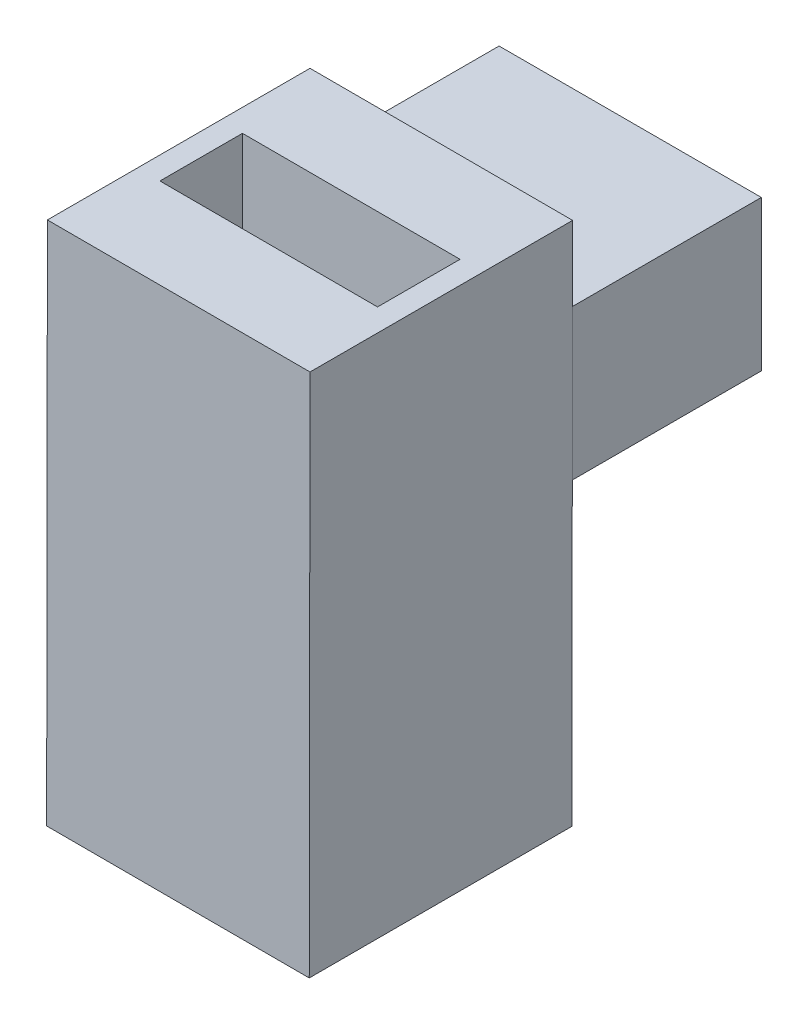
ISO-10303-21;
HEADER;
FILE_DESCRIPTION(('STEP AP214'),'2;1');
FILE_NAME('part.step','',(''),(''),'','','');
FILE_SCHEMA(('AUTOMOTIVE_DESIGN { 1 0 10303 214 1 1 1 1 }'));
ENDSEC;
DATA;
#1=APPLICATION_CONTEXT('core data for automotive mechanical design processes');
#2=APPLICATION_PROTOCOL_DEFINITION('international standard','automotive_design',2000,#1);
#3=PRODUCT_CONTEXT('',#1,'mechanical');
#4=PRODUCT('Part','Part','',(#3));
#5=PRODUCT_RELATED_PRODUCT_CATEGORY('part','',(#4));
#6=PRODUCT_DEFINITION_FORMATION('','',#4);
#7=PRODUCT_DEFINITION_CONTEXT('part definition',#1,'design');
#8=PRODUCT_DEFINITION('design','',#6,#7);
#9=PRODUCT_DEFINITION_SHAPE('','',#8);
#10=(LENGTH_UNIT() NAMED_UNIT(*) SI_UNIT(.MILLI.,.METRE.));
#11=(NAMED_UNIT(*) PLANE_ANGLE_UNIT() SI_UNIT($,.RADIAN.));
#12=(NAMED_UNIT(*) SI_UNIT($,.STERADIAN.) SOLID_ANGLE_UNIT());
#13=UNCERTAINTY_MEASURE_WITH_UNIT(LENGTH_MEASURE(1.E-05),#10,'distance_accuracy_value','');
#14=(GEOMETRIC_REPRESENTATION_CONTEXT(3) GLOBAL_UNCERTAINTY_ASSIGNED_CONTEXT((#13)) GLOBAL_UNIT_ASSIGNED_CONTEXT((#10,
#11,#12)) REPRESENTATION_CONTEXT('',''));
#15=CARTESIAN_POINT('',(0.,0.,0.));
#16=DIRECTION('',(0.,0.,1.));
#17=DIRECTION('',(1.,0.,0.));
#18=AXIS2_PLACEMENT_3D('',#15,#16,#17);
#19=CARTESIAN_POINT('',(7.27146352580136,111.848185649717,0.654476688319848));
#20=DIRECTION('',(0.,0.,-1.));
#21=DIRECTION('',(0.,1.,0.));
#22=AXIS2_PLACEMENT_3D('',#19,#20,#21);
#23=PLANE('',#22);
#24=DIRECTION('',(0.999998975550975,-0.00143139687045222,0.));
#25=VECTOR('',#24,1.);
#26=CARTESIAN_POINT('',(7.24999257274458,96.8482010164519,0.654476688319848));
#27=LINE('',#26,#25);
#28=CARTESIAN_POINT('',(-7.24999257274456,96.8689562710735,0.654476688319848));
#29=VERTEX_POINT('',#28);
#30=CARTESIAN_POINT('',(-6.16440768784106,96.8674023666747,0.654476688319848));
#31=VERTEX_POINT('',#30);
#32=EDGE_CURVE('E206',#29,#31,#27,.T.);
#33=ORIENTED_EDGE('',*,*,#32,.T.);
#34=CARTESIAN_POINT('',(6.16440768784106,96.8497549208506,0.654476688319848));
#35=VERTEX_POINT('',#34);
#36=EDGE_CURVE('E210',#31,#35,#27,.T.);
#37=ORIENTED_EDGE('',*,*,#36,.T.);
#38=CARTESIAN_POINT('',(7.24999257274458,96.8482010164519,0.654476688319848));
#39=VERTEX_POINT('',#38);
#40=EDGE_CURVE('E205',#35,#39,#27,.T.);
#41=ORIENTED_EDGE('',*,*,#40,.T.);
#42=DIRECTION('',(-0.00143139687045173,-0.999998975550975,0.));
#43=VECTOR('',#42,1.);
#44=CARTESIAN_POINT('',(7.27146352580136,111.848185649717,0.654476688319848));
#45=LINE('',#44,#43);
#46=CARTESIAN_POINT('',(7.27146352580135,111.848185649717,0.654476688319848));
#47=VERTEX_POINT('',#46);
#48=EDGE_CURVE('E224',#47,#39,#45,.T.);
#49=ORIENTED_EDGE('',*,*,#48,.F.);
#50=DIRECTION('',(0.999998975550975,-0.00143139687045222,0.));
#51=VECTOR('',#50,1.);
#52=CARTESIAN_POINT('',(7.27146352580136,111.848185649717,0.654476688319848));
#53=LINE('',#52,#51);
#54=CARTESIAN_POINT('',(-7.22852161968778,111.868940904338,0.654476688319848));
#55=VERTEX_POINT('',#54);
#56=EDGE_CURVE('E192',#55,#47,#53,.T.);
#57=ORIENTED_EDGE('',*,*,#56,.F.);
#58=DIRECTION('',(-0.00143139687045173,-0.999998975550975,0.));
#59=VECTOR('',#58,1.);
#60=CARTESIAN_POINT('',(-7.22852161968778,111.868940904338,0.654476688319848));
#61=LINE('',#60,#59);
#62=EDGE_CURVE('E202',#55,#29,#61,.T.);
#63=ORIENTED_EDGE('',*,*,#62,.T.);
#64=EDGE_LOOP('',(#33,#37,#41,#49,#57,#63));
#65=FACE_BOUND('',#64,.T.);
#66=CARTESIAN_POINT('',(0.,101.858578643763,0.654476688319848));
#67=DIRECTION('',(0.,0.,-1.));
#68=DIRECTION('',(0.,1.,0.));
#69=AXIS2_PLACEMENT_3D('',#66,#67,#68);
#70=CIRCLE('',#69,2.575);
#71=CARTESIAN_POINT('',(2.24000000000001,103.128627855408,0.654476688319848));
#72=VERTEX_POINT('',#71);
#73=CARTESIAN_POINT('',(-2.23999999999999,103.128627855408,0.654476688319848));
#74=VERTEX_POINT('',#73);
#75=EDGE_CURVE('E152',#72,#74,#70,.T.);
#76=ORIENTED_EDGE('',*,*,#75,.T.);
#77=DIRECTION('',(1.,0.,0.));
#78=VECTOR('',#77,1.);
#79=CARTESIAN_POINT('',(0.,103.128627855408,0.654476688319848));
#80=LINE('',#79,#78);
#81=EDGE_CURVE('E156',#74,#72,#80,.T.);
#82=ORIENTED_EDGE('',*,*,#81,.T.);
#83=EDGE_LOOP('',(#76,#82));
#84=FACE_BOUND('',#83,.T.);
#85=ADVANCED_FACE('F37',(#65,#84),#23,.F.);
#86=CARTESIAN_POINT('',(-2.24,103.128627855408,-17.9455233116802));
#87=DIRECTION('',(0.,1.,0.));
#88=DIRECTION('',(0.,0.,1.));
#89=AXIS2_PLACEMENT_3D('',#86,#87,#88);
#90=PLANE('',#89);
#91=DIRECTION('',(-1.,0.,0.));
#92=VECTOR('',#91,1.);
#93=CARTESIAN_POINT('',(-2.24,103.128627855408,-12.9455233116802));
#94=LINE('',#93,#92);
#95=CARTESIAN_POINT('',(2.24,103.128627855408,-12.9455233116802));
#96=VERTEX_POINT('',#95);
#97=CARTESIAN_POINT('',(-2.24,103.128627855408,-12.9455233116802));
#98=VERTEX_POINT('',#97);
#99=EDGE_CURVE('E11',#96,#98,#94,.T.);
#100=ORIENTED_EDGE('',*,*,#99,.F.);
#101=DIRECTION('',(0.,0.,1.));
#102=VECTOR('',#101,1.);
#103=CARTESIAN_POINT('',(2.24,103.128627855408,-17.9455233116802));
#104=LINE('',#103,#102);
#105=EDGE_CURVE('E52',#96,#72,#104,.T.);
#106=ORIENTED_EDGE('',*,*,#105,.T.);
#107=ORIENTED_EDGE('',*,*,#81,.F.);
#108=DIRECTION('',(0.,0.,1.));
#109=VECTOR('',#108,1.);
#110=CARTESIAN_POINT('',(-2.24,103.128627855408,-17.9455233116802));
#111=LINE('',#110,#109);
#112=EDGE_CURVE('E149',#98,#74,#111,.T.);
#113=ORIENTED_EDGE('',*,*,#112,.F.);
#114=EDGE_LOOP('',(#100,#106,#107,#113));
#115=FACE_BOUND('',#114,.T.);
#116=ADVANCED_FACE('F157',(#115),#90,.F.);
#117=CARTESIAN_POINT('',(-8.72812756073916,96.8710720710369,-17.9455233116802));
#118=DIRECTION('',(-0.00143139687045135,-0.999998975550975,0.));
#119=DIRECTION('',(0.999998975550975,-0.00143139687045135,0.));
#120=AXIS2_PLACEMENT_3D('',#117,#118,#119);
#121=PLANE('',#120);
#122=DIRECTION('',(-0.999998975550975,0.00143139687045222,0.));
#123=VECTOR('',#122,1.);
#124=CARTESIAN_POINT('',(7.24999257274458,96.8482010164519,6.15447668831985));
#125=LINE('',#124,#123);
#126=CARTESIAN_POINT('',(6.16440768784106,96.8497549208506,6.15447668831985));
#127=VERTEX_POINT('',#126);
#128=CARTESIAN_POINT('',(-6.16440768784106,96.8674023666747,6.15447668831985));
#129=VERTEX_POINT('',#128);
#130=EDGE_CURVE('E216',#127,#129,#125,.T.);
#131=ORIENTED_EDGE('',*,*,#130,.F.);
#132=CARTESIAN_POINT('',(0.,96.8585786437626,3.40447668831985));
#133=DIRECTION('',(-0.00143139687045135,-0.999998975550975,0.));
#134=DIRECTION('',(0.999998975550975,-0.00143139687045135,0.));
#135=AXIS2_PLACEMENT_3D('',#132,#133,#134);
#136=CIRCLE('',#135,6.75);
#137=EDGE_CURVE('E168',#127,#129,#136,.T.);
#138=ORIENTED_EDGE('',*,*,#137,.T.);
#139=EDGE_LOOP('',(#131,#138));
#140=FACE_BOUND('',#139,.T.);
#141=ADVANCED_FACE('F333',(#140),#121,.T.);
#142=ORIENTED_EDGE('',*,*,#36,.F.);
#143=EDGE_CURVE('E172',#31,#35,#136,.T.);
#144=ORIENTED_EDGE('',*,*,#143,.T.);
#145=EDGE_LOOP('',(#142,#144));
#146=FACE_BOUND('',#145,.T.);
#147=ADVANCED_FACE('F393',(#146),#121,.T.);
#148=CARTESIAN_POINT('',(8.74999103607103,96.8460539211462,-17.9455233116802));
#149=DIRECTION('',(1.,0.,0.));
#150=DIRECTION('',(0.,0.,-1.));
#151=AXIS2_PLACEMENT_3D('',#148,#149,#150);
#152=PLANE('',#151);
#153=DIRECTION('',(0.,1.,0.));
#154=VECTOR('',#153,1.);
#155=CARTESIAN_POINT('',(8.74999103607103,96.8460539211462,-5.34552331168015));
#156=LINE('',#155,#154);
#157=CARTESIAN_POINT('',(8.74999103607103,96.8460539211462,-5.34552331168015));
#158=VERTEX_POINT('',#157);
#159=CARTESIAN_POINT('',(8.74999103607103,106.858578643763,-5.34552331168015));
#160=VERTEX_POINT('',#159);
#161=EDGE_CURVE('E154',#158,#160,#156,.T.);
#162=ORIENTED_EDGE('',*,*,#161,.F.);
#163=DIRECTION('',(0.,0.,1.));
#164=VECTOR('',#163,1.);
#165=CARTESIAN_POINT('',(8.74999103607103,96.8460539211462,-17.9455233116802));
#166=LINE('',#165,#164);
#167=CARTESIAN_POINT('',(8.74999103607103,96.8460539211462,-17.9455233116802));
#168=VERTEX_POINT('',#167);
#169=EDGE_CURVE('E273',#168,#158,#166,.T.);
#170=ORIENTED_EDGE('',*,*,#169,.F.);
#171=DIRECTION('',(0.,1.,0.));
#172=VECTOR('',#171,1.);
#173=CARTESIAN_POINT('',(8.74999103607103,96.8460539211462,-17.9455233116802));
#174=LINE('',#173,#172);
#175=CARTESIAN_POINT('',(8.74999103607103,106.858578643763,-17.9455233116802));
#176=VERTEX_POINT('',#175);
#177=EDGE_CURVE('E252',#168,#176,#174,.T.);
#178=ORIENTED_EDGE('',*,*,#177,.T.);
#179=DIRECTION('',(0.,0.,1.));
#180=VECTOR('',#179,1.);
#181=CARTESIAN_POINT('',(8.74999103607103,106.858578643763,-17.9455233116802));
#182=LINE('',#181,#180);
#183=EDGE_CURVE('E265',#176,#160,#182,.T.);
#184=ORIENTED_EDGE('',*,*,#183,.T.);
#185=EDGE_LOOP('',(#162,#170,#178,#184));
#186=FACE_BOUND('',#185,.T.);
#187=ADVANCED_FACE('F39',(#186),#152,.T.);
#188=DIRECTION('',(0.999998975550975,-0.00143139687045173,0.));
#189=VECTOR('',#188,1.);
#190=CARTESIAN_POINT('',(-8.74999103607103,96.8711033663791,-5.34552331168015));
#191=LINE('',#190,#189);
#192=CARTESIAN_POINT('',(-8.72812756073916,96.8710720710369,-5.34552331168015));
#193=VERTEX_POINT('',#192);
#194=EDGE_CURVE('E45',#193,#158,#191,.T.);
#195=ORIENTED_EDGE('',*,*,#194,.F.);
#196=DIRECTION('',(0.,0.,1.));
#197=VECTOR('',#196,1.);
#198=CARTESIAN_POINT('',(-8.72812756073916,96.8710720710369,-17.9455233116802));
#199=LINE('',#198,#197);
#200=CARTESIAN_POINT('',(-8.72812756073916,96.8710720710369,-17.9455233116802));
#201=VERTEX_POINT('',#200);
#202=EDGE_CURVE('E276',#201,#193,#199,.T.);
#203=ORIENTED_EDGE('',*,*,#202,.F.);
#204=DIRECTION('',(0.999998975550975,-0.00143139687045135,0.));
#205=VECTOR('',#204,1.);
#206=CARTESIAN_POINT('',(-8.72812756073916,96.8710720710369,-17.9455233116802));
#207=LINE('',#206,#205);
#208=EDGE_CURVE('E262',#201,#168,#207,.T.);
#209=ORIENTED_EDGE('',*,*,#208,.T.);
#210=ORIENTED_EDGE('',*,*,#169,.T.);
#211=EDGE_LOOP('',(#195,#203,#209,#210));
#212=FACE_BOUND('',#211,.T.);
#213=ADVANCED_FACE('F309',(#212),#121,.T.);
#214=CARTESIAN_POINT('',(-8.72812756073916,96.8710720710369,-17.9455233116802));
#215=DIRECTION('',(-1.,0.,0.));
#216=DIRECTION('',(0.,0.,1.));
#217=AXIS2_PLACEMENT_3D('',#214,#215,#216);
#218=PLANE('',#217);
#219=DIRECTION('',(0.,-1.,0.));
#220=VECTOR('',#219,1.);
#221=CARTESIAN_POINT('',(-8.72812756073916,96.8710720710369,-5.34552331168015));
#222=LINE('',#221,#220);
#223=CARTESIAN_POINT('',(-8.72812756073916,106.858578643763,-5.34552331168015));
#224=VERTEX_POINT('',#223);
#225=EDGE_CURVE('E256',#224,#193,#222,.T.);
#226=ORIENTED_EDGE('',*,*,#225,.F.);
#227=DIRECTION('',(0.,0.,1.));
#228=VECTOR('',#227,1.);
#229=CARTESIAN_POINT('',(-8.72812756073916,106.858578643763,-17.9455233116802));
#230=LINE('',#229,#228);
#231=CARTESIAN_POINT('',(-8.72812756073916,106.858578643763,-17.9455233116802));
#232=VERTEX_POINT('',#231);
#233=EDGE_CURVE('E279',#232,#224,#230,.T.);
#234=ORIENTED_EDGE('',*,*,#233,.F.);
#235=DIRECTION('',(0.,-1.,0.));
#236=VECTOR('',#235,1.);
#237=CARTESIAN_POINT('',(-8.72812756073916,96.8710720710369,-17.9455233116802));
#238=LINE('',#237,#236);
#239=EDGE_CURVE('E259',#232,#201,#238,.T.);
#240=ORIENTED_EDGE('',*,*,#239,.T.);
#241=ORIENTED_EDGE('',*,*,#202,.T.);
#242=EDGE_LOOP('',(#226,#234,#240,#241));
#243=FACE_BOUND('',#242,.T.);
#244=ADVANCED_FACE('F311',(#243),#218,.T.);
#245=CARTESIAN_POINT('',(-8.72812756073916,106.858578643763,-17.9455233116802));
#246=DIRECTION('',(0.,1.,0.));
#247=DIRECTION('',(0.,0.,1.));
#248=AXIS2_PLACEMENT_3D('',#245,#246,#247);
#249=PLANE('',#248);
#250=DIRECTION('',(-1.,0.,0.));
#251=VECTOR('',#250,1.);
#252=CARTESIAN_POINT('',(-8.72812756073916,106.858578643763,-5.34552331168015));
#253=LINE('',#252,#251);
#254=EDGE_CURVE('E268',#160,#224,#253,.T.);
#255=ORIENTED_EDGE('',*,*,#254,.F.);
#256=ORIENTED_EDGE('',*,*,#183,.F.);
#257=DIRECTION('',(-1.,0.,0.));
#258=VECTOR('',#257,1.);
#259=CARTESIAN_POINT('',(-8.72812756073916,106.858578643763,-17.9455233116802));
#260=LINE('',#259,#258);
#261=EDGE_CURVE('E255',#176,#232,#260,.T.);
#262=ORIENTED_EDGE('',*,*,#261,.T.);
#263=ORIENTED_EDGE('',*,*,#233,.T.);
#264=EDGE_LOOP('',(#255,#256,#262,#263));
#265=FACE_BOUND('',#264,.T.);
#266=ADVANCED_FACE('F286',(#265),#249,.T.);
#267=CARTESIAN_POINT('',(0.,0.,-17.9455233116802));
#268=DIRECTION('',(0.,0.,-1.));
#269=DIRECTION('',(-1.,0.,0.));
#270=AXIS2_PLACEMENT_3D('',#267,#268,#269);
#271=PLANE('',#270);
#272=CARTESIAN_POINT('',(0.,101.858578643763,-17.9455233116802));
#273=DIRECTION('',(0.,0.,1.));
#274=DIRECTION('',(1.,0.,0.));
#275=AXIS2_PLACEMENT_3D('',#272,#273,#274);
#276=CIRCLE('',#275,2.575);
#277=CARTESIAN_POINT('',(2.575,101.858578643763,-17.9455233116802));
#278=VERTEX_POINT('',#277);
#279=EDGE_CURVE('E243',#278,#278,#276,.T.);
#280=ORIENTED_EDGE('',*,*,#279,.T.);
#281=EDGE_LOOP('',(#280));
#282=FACE_BOUND('',#281,.T.);
#283=ORIENTED_EDGE('',*,*,#177,.F.);
#284=ORIENTED_EDGE('',*,*,#208,.F.);
#285=ORIENTED_EDGE('',*,*,#239,.F.);
#286=ORIENTED_EDGE('',*,*,#261,.F.);
#287=EDGE_LOOP('',(#283,#284,#285,#286));
#288=FACE_BOUND('',#287,.T.);
#289=ADVANCED_FACE('F315',(#282,#288),#271,.T.);
#290=CARTESIAN_POINT('',(0.,101.858578643763,-17.9455233116802));
#291=DIRECTION('',(0.,0.,1.));
#292=DIRECTION('',(1.,0.,0.));
#293=AXIS2_PLACEMENT_3D('',#290,#291,#292);
#294=CYLINDRICAL_SURFACE('',#293,2.575);
#295=ORIENTED_EDGE('',*,*,#279,.F.);
#296=EDGE_LOOP('',(#295));
#297=FACE_BOUND('',#296,.T.);
#298=ORIENTED_EDGE('',*,*,#105,.F.);
#299=CARTESIAN_POINT('',(0.,101.858578643763,-12.9455233116802));
#300=DIRECTION('',(0.,0.,-1.));
#301=DIRECTION('',(-1.,0.,0.));
#302=AXIS2_PLACEMENT_3D('',#299,#300,#301);
#303=CIRCLE('',#302,2.575);
#304=EDGE_CURVE('E58',#98,#96,#303,.T.);
#305=ORIENTED_EDGE('',*,*,#304,.F.);
#306=ORIENTED_EDGE('',*,*,#112,.T.);
#307=ORIENTED_EDGE('',*,*,#75,.F.);
#308=EDGE_LOOP('',(#298,#305,#306,#307));
#309=FACE_BOUND('',#308,.T.);
#310=ADVANCED_FACE('F150',(#297,#309),#294,.F.);
#311=CARTESIAN_POINT('',(7.27146352580136,111.848185649717,6.15447668831985));
#312=DIRECTION('',(0.999998975550975,-0.00143139687045173,0.));
#313=DIRECTION('',(0.00143139687045173,0.999998975550975,0.));
#314=AXIS2_PLACEMENT_3D('',#311,#312,#313);
#315=PLANE('',#314);
#316=DIRECTION('',(0.,0.,1.));
#317=VECTOR('',#316,1.);
#318=CARTESIAN_POINT('',(7.24999257274458,96.8482010164519,6.15447668831985));
#319=LINE('',#318,#317);
#320=CARTESIAN_POINT('',(7.24999257274458,96.8482010164519,6.15447668831985));
#321=VERTEX_POINT('',#320);
#322=EDGE_CURVE('E209',#39,#321,#319,.T.);
#323=ORIENTED_EDGE('',*,*,#322,.T.);
#324=DIRECTION('',(-0.00143139687045173,-0.999998975550975,0.));
#325=VECTOR('',#324,1.);
#326=CARTESIAN_POINT('',(7.27146352580136,111.848185649717,6.15447668831985));
#327=LINE('',#326,#325);
#328=CARTESIAN_POINT('',(7.27146352580136,111.848185649717,6.15447668831985));
#329=VERTEX_POINT('',#328);
#330=EDGE_CURVE('E221',#329,#321,#327,.T.);
#331=ORIENTED_EDGE('',*,*,#330,.F.);
#332=DIRECTION('',(0.,0.,1.));
#333=VECTOR('',#332,1.);
#334=CARTESIAN_POINT('',(7.27146352580136,111.848185649717,6.15447668831985));
#335=LINE('',#334,#333);
#336=EDGE_CURVE('E196',#47,#329,#335,.T.);
#337=ORIENTED_EDGE('',*,*,#336,.F.);
#338=ORIENTED_EDGE('',*,*,#48,.T.);
#339=EDGE_LOOP('',(#323,#331,#337,#338));
#340=FACE_BOUND('',#339,.T.);
#341=ADVANCED_FACE('F323',(#340),#315,.F.);
#342=CARTESIAN_POINT('',(7.27146352580136,111.848185649717,6.15447668831985));
#343=DIRECTION('',(0.,0.,1.));
#344=DIRECTION('',(0.,-1.,0.));
#345=AXIS2_PLACEMENT_3D('',#342,#343,#344);
#346=PLANE('',#345);
#347=EDGE_CURVE('E193',#321,#127,#125,.T.);
#348=ORIENTED_EDGE('',*,*,#347,.T.);
#349=ORIENTED_EDGE('',*,*,#130,.T.);
#350=CARTESIAN_POINT('',(-7.24999257274456,96.8689562710734,6.15447668831985));
#351=VERTEX_POINT('',#350);
#352=EDGE_CURVE('E213',#129,#351,#125,.T.);
#353=ORIENTED_EDGE('',*,*,#352,.T.);
#354=DIRECTION('',(-0.00143139687045173,-0.999998975550975,0.));
#355=VECTOR('',#354,1.);
#356=CARTESIAN_POINT('',(-7.22852161968778,111.868940904338,6.15447668831985));
#357=LINE('',#356,#355);
#358=CARTESIAN_POINT('',(-7.22852161968778,111.868940904338,6.15447668831985));
#359=VERTEX_POINT('',#358);
#360=EDGE_CURVE('E217',#359,#351,#357,.T.);
#361=ORIENTED_EDGE('',*,*,#360,.F.);
#362=DIRECTION('',(-0.999998975550975,0.00143139687045222,0.));
#363=VECTOR('',#362,1.);
#364=CARTESIAN_POINT('',(7.27146352580136,111.848185649717,6.15447668831985));
#365=LINE('',#364,#363);
#366=EDGE_CURVE('E199',#329,#359,#365,.T.);
#367=ORIENTED_EDGE('',*,*,#366,.F.);
#368=ORIENTED_EDGE('',*,*,#330,.T.);
#369=EDGE_LOOP('',(#348,#349,#353,#361,#367,#368));
#370=FACE_BOUND('',#369,.T.);
#371=ADVANCED_FACE('F341',(#370),#346,.F.);
#372=CARTESIAN_POINT('',(-7.22852161968778,111.868940904338,6.15447668831985));
#373=DIRECTION('',(-0.999998975550975,0.00143139687045173,0.));
#374=DIRECTION('',(-0.00143139687045173,-0.999998975550975,0.));
#375=AXIS2_PLACEMENT_3D('',#372,#373,#374);
#376=PLANE('',#375);
#377=DIRECTION('',(0.,0.,-1.));
#378=VECTOR('',#377,1.);
#379=CARTESIAN_POINT('',(-7.24999257274456,96.8689562710734,6.15447668831985));
#380=LINE('',#379,#378);
#381=EDGE_CURVE('E188',#351,#29,#380,.T.);
#382=ORIENTED_EDGE('',*,*,#381,.T.);
#383=ORIENTED_EDGE('',*,*,#62,.F.);
#384=DIRECTION('',(0.,0.,-1.));
#385=VECTOR('',#384,1.);
#386=CARTESIAN_POINT('',(-7.22852161968778,111.868940904338,6.15447668831985));
#387=LINE('',#386,#385);
#388=EDGE_CURVE('E189',#359,#55,#387,.T.);
#389=ORIENTED_EDGE('',*,*,#388,.F.);
#390=ORIENTED_EDGE('',*,*,#360,.T.);
#391=EDGE_LOOP('',(#382,#383,#389,#390));
#392=FACE_BOUND('',#391,.T.);
#393=ADVANCED_FACE('F338',(#392),#376,.F.);
#394=CARTESIAN_POINT('',(0.160113877371107,111.858364823776,0.));
#395=DIRECTION('',(-0.00143139687045173,-0.999998975550975,0.));
#396=DIRECTION('',(0.999998975550975,-0.00143139687045173,0.));
#397=AXIS2_PLACEMENT_3D('',#394,#395,#396);
#398=PLANE('',#397);
#399=ORIENTED_EDGE('',*,*,#366,.T.);
#400=ORIENTED_EDGE('',*,*,#388,.T.);
#401=ORIENTED_EDGE('',*,*,#56,.T.);
#402=ORIENTED_EDGE('',*,*,#336,.T.);
#403=EDGE_LOOP('',(#399,#400,#401,#402));
#404=FACE_BOUND('',#403,.T.);
#405=DIRECTION('',(0.999998975550975,-0.00143139687045173,0.));
#406=VECTOR('',#405,1.);
#407=CARTESIAN_POINT('',(-8.72852008301425,111.871087999644,-5.34552331168015));
#408=LINE('',#407,#406);
#409=CARTESIAN_POINT('',(-8.72852008301425,111.871087999644,-5.34552331168015));
#410=VERTEX_POINT('',#409);
#411=CARTESIAN_POINT('',(8.77146198912781,111.846038554411,-5.34552331168015));
#412=VERTEX_POINT('',#411);
#413=EDGE_CURVE('E220',#410,#412,#408,.T.);
#414=ORIENTED_EDGE('',*,*,#413,.F.);
#415=DIRECTION('',(0.,0.,-1.));
#416=VECTOR('',#415,1.);
#417=CARTESIAN_POINT('',(-8.72852008301426,111.871087999644,12.1544766883198));
#418=LINE('',#417,#416);
#419=CARTESIAN_POINT('',(-8.72852008301426,111.871087999644,12.1544766883198));
#420=VERTEX_POINT('',#419);
#421=EDGE_CURVE('E237',#420,#410,#418,.T.);
#422=ORIENTED_EDGE('',*,*,#421,.F.);
#423=DIRECTION('',(-0.999998975550975,0.00143139687045173,0.));
#424=VECTOR('',#423,1.);
#425=CARTESIAN_POINT('',(8.77146198912781,111.846038554411,12.1544766883198));
#426=LINE('',#425,#424);
#427=CARTESIAN_POINT('',(8.77146198912781,111.846038554411,12.1544766883198));
#428=VERTEX_POINT('',#427);
#429=EDGE_CURVE('E234',#428,#420,#426,.T.);
#430=ORIENTED_EDGE('',*,*,#429,.F.);
#431=DIRECTION('',(0.,0.,1.));
#432=VECTOR('',#431,1.);
#433=CARTESIAN_POINT('',(8.77146198912781,111.846038554411,-5.34552331168015));
#434=LINE('',#433,#432);
#435=EDGE_CURVE('E231',#412,#428,#434,.T.);
#436=ORIENTED_EDGE('',*,*,#435,.F.);
#437=EDGE_LOOP('',(#414,#422,#430,#436));
#438=FACE_BOUND('',#437,.T.);
#439=ADVANCED_FACE('F298',(#404,#438),#398,.F.);
#440=CARTESIAN_POINT('',(8.77146198912781,111.846038554411,-5.34552331168015));
#441=DIRECTION('',(0.999998975550975,-0.00143139687045173,0.));
#442=DIRECTION('',(0.00143139687045173,0.999998975550975,0.));
#443=AXIS2_PLACEMENT_3D('',#440,#441,#442);
#444=PLANE('',#443);
#445=DIRECTION('',(-0.00143139687045173,-0.999998975550975,0.));
#446=VECTOR('',#445,1.);
#447=CARTESIAN_POINT('',(8.77146198912781,111.846038554411,12.1544766883198));
#448=LINE('',#447,#446);
#449=CARTESIAN_POINT('',(8.721363098662,76.8460744101267,12.1544766883198));
#450=VERTEX_POINT('',#449);
#451=EDGE_CURVE('E246',#428,#450,#448,.T.);
#452=ORIENTED_EDGE('',*,*,#451,.T.);
#453=DIRECTION('',(0.,0.,1.));
#454=VECTOR('',#453,1.);
#455=CARTESIAN_POINT('',(8.72136309866201,76.8460744101267,-5.34552331168015));
#456=LINE('',#455,#454);
#457=CARTESIAN_POINT('',(8.72136309866201,76.8460744101267,-5.34552331168015));
#458=VERTEX_POINT('',#457);
#459=EDGE_CURVE('E167',#458,#450,#456,.T.);
#460=ORIENTED_EDGE('',*,*,#459,.F.);
#461=DIRECTION('',(0.00143139687045135,0.999998975550975,0.));
#462=VECTOR('',#461,1.);
#463=CARTESIAN_POINT('',(8.72136309866201,76.8460744101267,-5.34552331168015));
#464=LINE('',#463,#462);
#465=EDGE_CURVE('E183',#458,#158,#464,.T.);
#466=ORIENTED_EDGE('',*,*,#465,.T.);
#467=DIRECTION('',(-0.00143139687045173,-0.999998975550975,0.));
#468=VECTOR('',#467,1.);
#469=CARTESIAN_POINT('',(8.77146198912781,111.846038554411,-5.34552331168015));
#470=LINE('',#469,#468);
#471=EDGE_CURVE('E240',#412,#158,#470,.T.);
#472=ORIENTED_EDGE('',*,*,#471,.F.);
#473=ORIENTED_EDGE('',*,*,#435,.T.);
#474=EDGE_LOOP('',(#452,#460,#466,#472,#473));
#475=FACE_BOUND('',#474,.T.);
#476=ADVANCED_FACE('F293',(#475),#444,.T.);
#477=CARTESIAN_POINT('',(8.77146198912781,111.846038554411,12.1544766883198));
#478=DIRECTION('',(0.,0.,1.));
#479=DIRECTION('',(1.,0.,0.));
#480=AXIS2_PLACEMENT_3D('',#477,#478,#479);
#481=PLANE('',#480);
#482=DIRECTION('',(-0.00143139687045173,-0.999998975550975,0.));
#483=VECTOR('',#482,1.);
#484=CARTESIAN_POINT('',(-8.72852008301426,111.871087999644,12.1544766883198));
#485=LINE('',#484,#483);
#486=CARTESIAN_POINT('',(-8.77861897348006,76.8711238553596,12.1544766883198));
#487=VERTEX_POINT('',#486);
#488=EDGE_CURVE('E244',#420,#487,#485,.T.);
#489=ORIENTED_EDGE('',*,*,#488,.T.);
#490=DIRECTION('',(-0.999998975550975,0.00143139687045173,0.));
#491=VECTOR('',#490,1.);
#492=CARTESIAN_POINT('',(-8.77861897348006,76.8711238553596,12.1544766883198));
#493=LINE('',#492,#491);
#494=EDGE_CURVE('E175',#450,#487,#493,.T.);
#495=ORIENTED_EDGE('',*,*,#494,.F.);
#496=ORIENTED_EDGE('',*,*,#451,.F.);
#497=ORIENTED_EDGE('',*,*,#429,.T.);
#498=EDGE_LOOP('',(#489,#495,#496,#497));
#499=FACE_BOUND('',#498,.T.);
#500=ADVANCED_FACE('F301',(#499),#481,.T.);
#501=CARTESIAN_POINT('',(-8.72852008301426,111.871087999644,12.1544766883198));
#502=DIRECTION('',(-0.999998975550975,0.00143139687045173,0.));
#503=DIRECTION('',(-0.00143139687045173,-0.999998975550975,0.));
#504=AXIS2_PLACEMENT_3D('',#501,#502,#503);
#505=PLANE('',#504);
#506=DIRECTION('',(-0.00143139687045173,-0.999998975550975,0.));
#507=VECTOR('',#506,1.);
#508=CARTESIAN_POINT('',(-8.72852008301425,111.871087999644,-5.34552331168015));
#509=LINE('',#508,#507);
#510=CARTESIAN_POINT('',(-8.77861897348005,76.8711238553596,-5.34552331168015));
#511=VERTEX_POINT('',#510);
#512=EDGE_CURVE('E241',#410,#511,#509,.T.);
#513=ORIENTED_EDGE('',*,*,#512,.T.);
#514=DIRECTION('',(0.,0.,-1.));
#515=VECTOR('',#514,1.);
#516=CARTESIAN_POINT('',(-8.77861897348005,76.8711238553596,-5.34552331168015));
#517=LINE('',#516,#515);
#518=EDGE_CURVE('E178',#487,#511,#517,.T.);
#519=ORIENTED_EDGE('',*,*,#518,.F.);
#520=ORIENTED_EDGE('',*,*,#488,.F.);
#521=ORIENTED_EDGE('',*,*,#421,.T.);
#522=EDGE_LOOP('',(#513,#519,#520,#521));
#523=FACE_BOUND('',#522,.T.);
#524=ADVANCED_FACE('F346',(#523),#505,.T.);
#525=CARTESIAN_POINT('',(-8.72852008301425,111.871087999644,-5.34552331168015));
#526=DIRECTION('',(0.,0.,-1.));
#527=DIRECTION('',(-1.,0.,0.));
#528=AXIS2_PLACEMENT_3D('',#525,#526,#527);
#529=PLANE('',#528);
#530=ORIENTED_EDGE('',*,*,#471,.T.);
#531=ORIENTED_EDGE('',*,*,#161,.T.);
#532=ORIENTED_EDGE('',*,*,#254,.T.);
#533=ORIENTED_EDGE('',*,*,#225,.T.);
#534=ORIENTED_EDGE('',*,*,#194,.T.);
#535=ORIENTED_EDGE('',*,*,#465,.F.);
#536=DIRECTION('',(0.999998975550975,-0.00143139687045173,0.));
#537=VECTOR('',#536,1.);
#538=CARTESIAN_POINT('',(-8.77861897348005,76.8711238553596,-5.34552331168015));
#539=LINE('',#538,#537);
#540=EDGE_CURVE('E181',#511,#458,#539,.T.);
#541=ORIENTED_EDGE('',*,*,#540,.F.);
#542=ORIENTED_EDGE('',*,*,#512,.F.);
#543=ORIENTED_EDGE('',*,*,#413,.T.);
#544=EDGE_LOOP('',(#530,#531,#532,#533,#534,#535,#541,#542,#543));
#545=FACE_BOUND('',#544,.T.);
#546=ADVANCED_FACE('F289',(#545),#529,.T.);
#547=CARTESIAN_POINT('',(0.138642924314331,96.8583801905114,0.));
#548=DIRECTION('',(0.00143139687045173,0.999998975550975,0.));
#549=DIRECTION('',(-0.999998975550975,0.00143139687045173,0.));
#550=AXIS2_PLACEMENT_3D('',#547,#548,#549);
#551=PLANE('',#550);
#552=ORIENTED_EDGE('',*,*,#352,.F.);
#553=EDGE_CURVE('E171',#129,#31,#136,.T.);
#554=ORIENTED_EDGE('',*,*,#553,.T.);
#555=ORIENTED_EDGE('',*,*,#32,.F.);
#556=ORIENTED_EDGE('',*,*,#381,.F.);
#557=EDGE_LOOP('',(#552,#554,#555,#556));
#558=FACE_BOUND('',#557,.T.);
#559=ADVANCED_FACE('F355',(#558),#551,.T.);
#560=ORIENTED_EDGE('',*,*,#347,.F.);
#561=ORIENTED_EDGE('',*,*,#322,.F.);
#562=ORIENTED_EDGE('',*,*,#40,.F.);
#563=EDGE_CURVE('E163',#35,#127,#136,.T.);
#564=ORIENTED_EDGE('',*,*,#563,.T.);
#565=EDGE_LOOP('',(#560,#561,#562,#564));
#566=FACE_BOUND('',#565,.T.);
#567=ADVANCED_FACE('F359',(#566),#551,.T.);
#568=CARTESIAN_POINT('',(0.110014986905304,76.8584006794919,0.));
#569=DIRECTION('',(0.00143139687045173,0.999998975550975,0.));
#570=DIRECTION('',(-0.999998975550975,0.00143139687045173,0.));
#571=AXIS2_PLACEMENT_3D('',#568,#569,#570);
#572=PLANE('',#571);
#573=ORIENTED_EDGE('',*,*,#459,.T.);
#574=ORIENTED_EDGE('',*,*,#494,.T.);
#575=ORIENTED_EDGE('',*,*,#518,.T.);
#576=ORIENTED_EDGE('',*,*,#540,.T.);
#577=EDGE_LOOP('',(#573,#574,#575,#576));
#578=FACE_BOUND('',#577,.T.);
#579=CARTESIAN_POINT('',(-0.0286279374090251,76.8585991327432,3.40447668831985));
#580=DIRECTION('',(-0.00143139687045135,-0.999998975550975,0.));
#581=DIRECTION('',(0.999998975550975,-0.00143139687045135,0.));
#582=AXIS2_PLACEMENT_3D('',#579,#580,#581);
#583=CIRCLE('',#582,6.75);
#584=CARTESIAN_POINT('',(6.72136514756006,76.8489372038676,3.40447668831985));
#585=VERTEX_POINT('',#584);
#586=EDGE_CURVE('E164',#585,#585,#583,.T.);
#587=ORIENTED_EDGE('',*,*,#586,.F.);
#588=EDGE_LOOP('',(#587));
#589=FACE_BOUND('',#588,.T.);
#590=ADVANCED_FACE('F304',(#578,#589),#572,.F.);
#591=CARTESIAN_POINT('',(-0.0286279374090251,76.8585991327432,3.40447668831985));
#592=DIRECTION('',(0.00143139687045135,0.999998975550975,0.));
#593=DIRECTION('',(-0.999998975550975,0.00143139687045135,0.));
#594=AXIS2_PLACEMENT_3D('',#591,#592,#593);
#595=CYLINDRICAL_SURFACE('',#594,6.75);
#596=ORIENTED_EDGE('',*,*,#586,.T.);
#597=EDGE_LOOP('',(#596));
#598=FACE_BOUND('',#597,.T.);
#599=ORIENTED_EDGE('',*,*,#137,.F.);
#600=ORIENTED_EDGE('',*,*,#563,.F.);
#601=ORIENTED_EDGE('',*,*,#143,.F.);
#602=ORIENTED_EDGE('',*,*,#553,.F.);
#603=EDGE_LOOP('',(#599,#600,#601,#602));
#604=FACE_BOUND('',#603,.T.);
#605=ADVANCED_FACE('F384',(#598,#604),#595,.F.);
#606=CARTESIAN_POINT('',(0.,101.858578643763,-12.9455233116802));
#607=DIRECTION('',(0.,0.,-1.));
#608=DIRECTION('',(-1.,0.,0.));
#609=AXIS2_PLACEMENT_3D('',#606,#607,#608);
#610=PLANE('',#609);
#611=ORIENTED_EDGE('',*,*,#99,.T.);
#612=ORIENTED_EDGE('',*,*,#304,.T.);
#613=EDGE_LOOP('',(#611,#612));
#614=FACE_BOUND('',#613,.T.);
#615=ADVANCED_FACE('F488',(#614),#610,.T.);
#616=CLOSED_SHELL('',(#85,#116,#141,#147,#187,#213,#244,#266,#289,#310,#341,#371,#393,#439,#476,
#500,#524,#546,#559,#567,#590,#605,#615));
#617=MANIFOLD_SOLID_BREP('B2',#616);
#618=ADVANCED_BREP_SHAPE_REPRESENTATION('',(#18,#617),#14);
#619=SHAPE_DEFINITION_REPRESENTATION(#9,#618);
ENDSEC;
END-ISO-10303-21;
